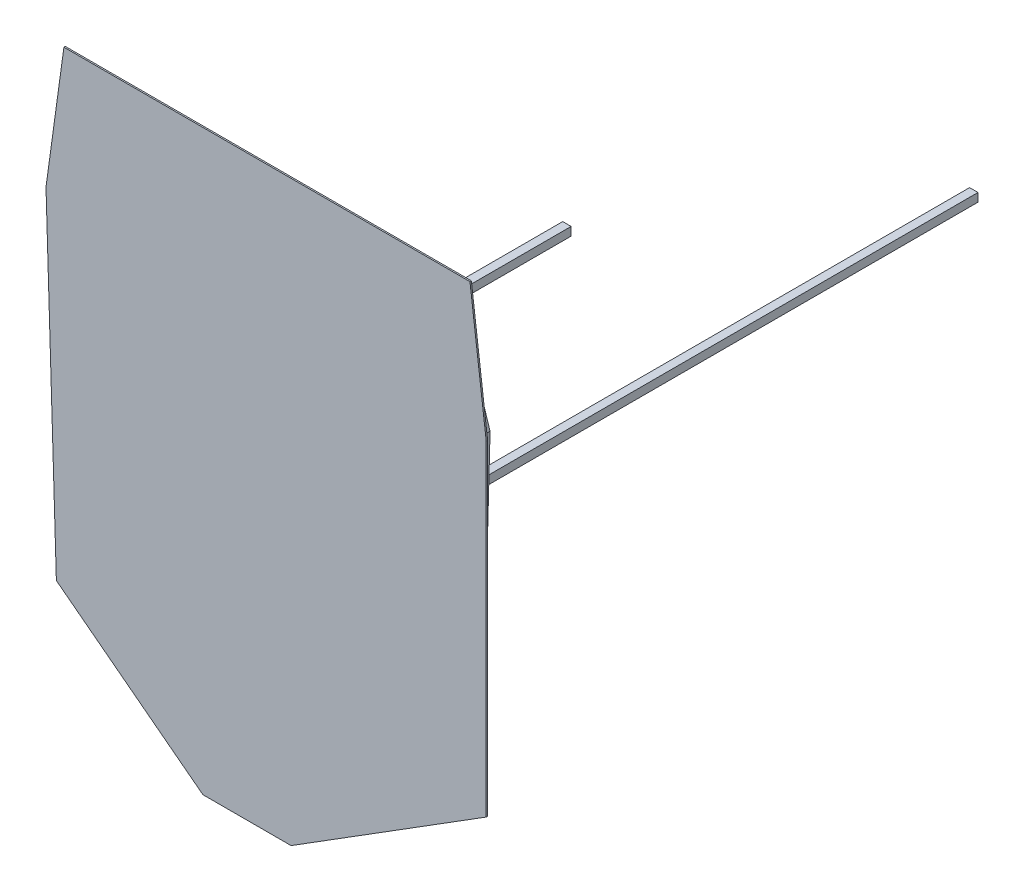
ISO-10303-21;
HEADER;
FILE_DESCRIPTION(('STEP AP214'),'2;1');
FILE_NAME('part.step','',(''),(''),'','','');
FILE_SCHEMA(('AUTOMOTIVE_DESIGN { 1 0 10303 214 1 1 1 1 }'));
ENDSEC;
DATA;
#1=APPLICATION_CONTEXT('core data for automotive mechanical design processes');
#2=APPLICATION_PROTOCOL_DEFINITION('international standard','automotive_design',2000,#1);
#3=PRODUCT_CONTEXT('',#1,'mechanical');
#4=PRODUCT('Part','Part','',(#3));
#5=PRODUCT_RELATED_PRODUCT_CATEGORY('part','',(#4));
#6=PRODUCT_DEFINITION_FORMATION('','',#4);
#7=PRODUCT_DEFINITION_CONTEXT('part definition',#1,'design');
#8=PRODUCT_DEFINITION('design','',#6,#7);
#9=PRODUCT_DEFINITION_SHAPE('','',#8);
#10=(LENGTH_UNIT() NAMED_UNIT(*) SI_UNIT(.MILLI.,.METRE.));
#11=(NAMED_UNIT(*) PLANE_ANGLE_UNIT() SI_UNIT($,.RADIAN.));
#12=(NAMED_UNIT(*) SI_UNIT($,.STERADIAN.) SOLID_ANGLE_UNIT());
#13=UNCERTAINTY_MEASURE_WITH_UNIT(LENGTH_MEASURE(1.E-05),#10,'distance_accuracy_value','');
#14=(GEOMETRIC_REPRESENTATION_CONTEXT(3) GLOBAL_UNCERTAINTY_ASSIGNED_CONTEXT((#13)) GLOBAL_UNIT_ASSIGNED_CONTEXT((#10,
#11,#12)) REPRESENTATION_CONTEXT('',''));
#15=CARTESIAN_POINT('',(0.,0.,0.));
#16=DIRECTION('',(0.,0.,1.));
#17=DIRECTION('',(1.,0.,0.));
#18=AXIS2_PLACEMENT_3D('',#15,#16,#17);
#19=CARTESIAN_POINT('',(0.,0.,0.));
#20=DIRECTION('',(0.,0.,-1.));
#21=DIRECTION('',(-1.,0.,0.));
#22=AXIS2_PLACEMENT_3D('',#19,#20,#21);
#23=PLANE('',#22);
#24=DIRECTION('',(0.0524810845736414,-0.998621918326438,0.));
#25=VECTOR('',#24,1.);
#26=CARTESIAN_POINT('',(-5.37432201257743,-157.093376415422,0.));
#27=LINE('',#26,#25);
#28=CARTESIAN_POINT('',(-17.1380774704205,66.7500166369865,0.));
#29=VERTEX_POINT('',#28);
#30=CARTESIAN_POINT('',(-5.37432201257743,-157.093376415422,0.));
#31=VERTEX_POINT('',#30);
#32=EDGE_CURVE('E281',#29,#31,#27,.T.);
#33=ORIENTED_EDGE('',*,*,#32,.F.);
#34=DIRECTION('',(-0.388851506030991,-0.921300442992095,0.));
#35=VECTOR('',#34,1.);
#36=CARTESIAN_POINT('',(-17.1380774704205,66.7500166369865,0.));
#37=LINE('',#36,#35);
#38=CARTESIAN_POINT('',(11.2463802612385,134.000915956337,0.));
#39=VERTEX_POINT('',#38);
#40=EDGE_CURVE('E303',#39,#29,#37,.T.);
#41=ORIENTED_EDGE('',*,*,#40,.F.);
#42=DIRECTION('',(-1.,0.,0.));
#43=VECTOR('',#42,1.);
#44=CARTESIAN_POINT('',(11.2463802612385,134.000915956337,0.));
#45=LINE('',#44,#43);
#46=CARTESIAN_POINT('',(274.564409594787,134.000915956337,0.));
#47=VERTEX_POINT('',#46);
#48=EDGE_CURVE('E300',#47,#39,#45,.T.);
#49=ORIENTED_EDGE('',*,*,#48,.F.);
#50=DIRECTION('',(-0.305444552392388,0.95220986416536,0.));
#51=VECTOR('',#50,1.);
#52=CARTESIAN_POINT('',(274.564409594787,134.000915956337,0.));
#53=LINE('',#52,#51);
#54=CARTESIAN_POINT('',(292.219085417534,78.96324599172,0.));
#55=VERTEX_POINT('',#54);
#56=EDGE_CURVE('E297',#55,#47,#53,.T.);
#57=ORIENTED_EDGE('',*,*,#56,.F.);
#58=DIRECTION('',(0.0277830020677739,0.999613977891517,0.));
#59=VECTOR('',#58,1.);
#60=CARTESIAN_POINT('',(292.219085417534,78.96324599172,0.));
#61=LINE('',#60,#59);
#62=CARTESIAN_POINT('',(285.658191138842,-157.093376415422,0.));
#63=VERTEX_POINT('',#62);
#64=EDGE_CURVE('E294',#63,#55,#61,.T.);
#65=ORIENTED_EDGE('',*,*,#64,.F.);
#66=DIRECTION('',(0.845314947439892,0.534268321758546,0.));
#67=VECTOR('',#66,1.);
#68=CARTESIAN_POINT('',(285.658191138842,-157.093376415422,0.));
#69=LINE('',#68,#67);
#70=CARTESIAN_POINT('',(157.625700404435,-238.01434458522,0.));
#71=VERTEX_POINT('',#70);
#72=EDGE_CURVE('E291',#71,#63,#69,.T.);
#73=ORIENTED_EDGE('',*,*,#72,.F.);
#74=DIRECTION('',(1.,0.,0.));
#75=VECTOR('',#74,1.);
#76=CARTESIAN_POINT('',(157.625700404435,-238.01434458522,0.));
#77=LINE('',#76,#75);
#78=CARTESIAN_POINT('',(94.9950880538378,-238.01434458522,0.));
#79=VERTEX_POINT('',#78);
#80=EDGE_CURVE('E288',#79,#71,#77,.T.);
#81=ORIENTED_EDGE('',*,*,#80,.F.);
#82=DIRECTION('',(0.778496811313602,-0.627648559923906,0.));
#83=VECTOR('',#82,1.);
#84=CARTESIAN_POINT('',(94.9950880538378,-238.01434458522,0.));
#85=LINE('',#84,#83);
#86=EDGE_CURVE('E284',#31,#79,#85,.T.);
#87=ORIENTED_EDGE('',*,*,#86,.F.);
#88=EDGE_LOOP('',(#33,#41,#49,#57,#65,#73,#81,#87));
#89=FACE_BOUND('',#88,.T.);
#90=DIRECTION('',(-1.,0.,0.));
#91=VECTOR('',#90,1.);
#92=CARTESIAN_POINT('',(0.,-121.721693300611,0.));
#93=LINE('',#92,#91);
#94=CARTESIAN_POINT('',(0.,-121.721693300611,0.));
#95=VERTEX_POINT('',#94);
#96=CARTESIAN_POINT('',(-6.,-121.721693300611,0.));
#97=VERTEX_POINT('',#96);
#98=EDGE_CURVE('E267',#95,#97,#93,.T.);
#99=ORIENTED_EDGE('',*,*,#98,.F.);
#100=DIRECTION('',(0.,-1.,0.));
#101=VECTOR('',#100,1.);
#102=CARTESIAN_POINT('',(0.,-115.721693300611,0.));
#103=LINE('',#102,#101);
#104=CARTESIAN_POINT('',(0.,-115.721693300611,0.));
#105=VERTEX_POINT('',#104);
#106=EDGE_CURVE('E253',#105,#95,#103,.T.);
#107=ORIENTED_EDGE('',*,*,#106,.F.);
#108=DIRECTION('',(1.,0.,0.));
#109=VECTOR('',#108,1.);
#110=CARTESIAN_POINT('',(-6.,-115.721693300611,0.));
#111=LINE('',#110,#109);
#112=CARTESIAN_POINT('',(-6.,-115.721693300611,0.));
#113=VERTEX_POINT('',#112);
#114=EDGE_CURVE('E258',#113,#105,#111,.T.);
#115=ORIENTED_EDGE('',*,*,#114,.F.);
#116=DIRECTION('',(0.,1.,0.));
#117=VECTOR('',#116,1.);
#118=CARTESIAN_POINT('',(-6.,-121.721693300611,0.));
#119=LINE('',#118,#117);
#120=EDGE_CURVE('E269',#97,#113,#119,.T.);
#121=ORIENTED_EDGE('',*,*,#120,.F.);
#122=EDGE_LOOP('',(#99,#107,#115,#121));
#123=FACE_BOUND('',#122,.T.);
#124=DIRECTION('',(1.,0.,0.));
#125=VECTOR('',#124,1.);
#126=CARTESIAN_POINT('',(284.,50.2389394642747,0.));
#127=LINE('',#126,#125);
#128=CARTESIAN_POINT('',(284.,50.2389394642747,0.));
#129=VERTEX_POINT('',#128);
#130=CARTESIAN_POINT('',(290.,50.2389394642747,0.));
#131=VERTEX_POINT('',#130);
#132=EDGE_CURVE('E224',#129,#131,#127,.T.);
#133=ORIENTED_EDGE('',*,*,#132,.F.);
#134=DIRECTION('',(0.,1.,0.));
#135=VECTOR('',#134,1.);
#136=CARTESIAN_POINT('',(284.,44.2389394642747,0.));
#137=LINE('',#136,#135);
#138=CARTESIAN_POINT('',(284.,44.2389394642747,0.));
#139=VERTEX_POINT('',#138);
#140=EDGE_CURVE('E221',#139,#129,#137,.T.);
#141=ORIENTED_EDGE('',*,*,#140,.F.);
#142=DIRECTION('',(-1.,0.,0.));
#143=VECTOR('',#142,1.);
#144=CARTESIAN_POINT('',(284.,44.2389394642747,0.));
#145=LINE('',#144,#143);
#146=CARTESIAN_POINT('',(290.,44.2389394642747,0.));
#147=VERTEX_POINT('',#146);
#148=EDGE_CURVE('E234',#147,#139,#145,.T.);
#149=ORIENTED_EDGE('',*,*,#148,.F.);
#150=DIRECTION('',(0.,-1.,0.));
#151=VECTOR('',#150,1.);
#152=CARTESIAN_POINT('',(290.,44.2389394642747,0.));
#153=LINE('',#152,#151);
#154=EDGE_CURVE('E242',#131,#147,#153,.T.);
#155=ORIENTED_EDGE('',*,*,#154,.F.);
#156=EDGE_LOOP('',(#133,#141,#149,#155));
#157=FACE_BOUND('',#156,.T.);
#158=ADVANCED_FACE('F33',(#89,#123,#157),#23,.T.);
#159=CARTESIAN_POINT('',(-5.37432201257743,-157.093376415422,0.));
#160=DIRECTION('',(-0.998621918326438,-0.0524810845736414,0.));
#161=DIRECTION('',(0.0524810845736414,-0.998621918326438,0.));
#162=AXIS2_PLACEMENT_3D('',#159,#160,#161);
#163=PLANE('',#162);
#164=DIRECTION('',(0.0524810845736414,-0.998621918326438,0.));
#165=VECTOR('',#164,1.);
#166=CARTESIAN_POINT('',(-5.37432201257743,-157.093376415422,5.));
#167=LINE('',#166,#165);
#168=CARTESIAN_POINT('',(-17.1380774704205,66.7500166369865,5.));
#169=VERTEX_POINT('',#168);
#170=CARTESIAN_POINT('',(-5.37432201257743,-157.093376415422,5.));
#171=VERTEX_POINT('',#170);
#172=EDGE_CURVE('E280',#169,#171,#167,.T.);
#173=ORIENTED_EDGE('',*,*,#172,.F.);
#174=DIRECTION('',(0.,0.,1.));
#175=VECTOR('',#174,1.);
#176=CARTESIAN_POINT('',(-17.1380774704205,66.7500166369865,0.));
#177=LINE('',#176,#175);
#178=EDGE_CURVE('E11',#29,#169,#177,.T.);
#179=ORIENTED_EDGE('',*,*,#178,.F.);
#180=ORIENTED_EDGE('',*,*,#32,.T.);
#181=DIRECTION('',(0.,0.,1.));
#182=VECTOR('',#181,1.);
#183=CARTESIAN_POINT('',(-5.37432201257743,-157.093376415422,0.));
#184=LINE('',#183,#182);
#185=EDGE_CURVE('E36',#31,#171,#184,.T.);
#186=ORIENTED_EDGE('',*,*,#185,.T.);
#187=EDGE_LOOP('',(#173,#179,#180,#186));
#188=FACE_BOUND('',#187,.T.);
#189=ADVANCED_FACE('F342',(#188),#163,.T.);
#190=CARTESIAN_POINT('',(-17.1380774704205,66.7500166369865,0.));
#191=DIRECTION('',(-0.921300442992095,0.388851506030991,0.));
#192=DIRECTION('',(-0.388851506030991,-0.921300442992095,0.));
#193=AXIS2_PLACEMENT_3D('',#190,#191,#192);
#194=PLANE('',#193);
#195=DIRECTION('',(-0.388851506030991,-0.921300442992095,0.));
#196=VECTOR('',#195,1.);
#197=CARTESIAN_POINT('',(-17.1380774704205,66.7500166369865,5.));
#198=LINE('',#197,#196);
#199=CARTESIAN_POINT('',(11.2463802612385,134.000915956337,5.));
#200=VERTEX_POINT('',#199);
#201=EDGE_CURVE('E285',#200,#169,#198,.T.);
#202=ORIENTED_EDGE('',*,*,#201,.F.);
#203=DIRECTION('',(0.,0.,1.));
#204=VECTOR('',#203,1.);
#205=CARTESIAN_POINT('',(11.2463802612385,134.000915956337,0.));
#206=LINE('',#205,#204);
#207=EDGE_CURVE('E41',#39,#200,#206,.T.);
#208=ORIENTED_EDGE('',*,*,#207,.F.);
#209=ORIENTED_EDGE('',*,*,#40,.T.);
#210=ORIENTED_EDGE('',*,*,#178,.T.);
#211=EDGE_LOOP('',(#202,#208,#209,#210));
#212=FACE_BOUND('',#211,.T.);
#213=ADVANCED_FACE('F352',(#212),#194,.T.);
#214=CARTESIAN_POINT('',(11.2463802612385,134.000915956337,0.));
#215=DIRECTION('',(0.,1.,0.));
#216=DIRECTION('',(0.,0.,1.));
#217=AXIS2_PLACEMENT_3D('',#214,#215,#216);
#218=PLANE('',#217);
#219=DIRECTION('',(-1.,0.,0.));
#220=VECTOR('',#219,1.);
#221=CARTESIAN_POINT('',(11.2463802612385,134.000915956337,5.));
#222=LINE('',#221,#220);
#223=CARTESIAN_POINT('',(274.564409594787,134.000915956337,5.));
#224=VERTEX_POINT('',#223);
#225=EDGE_CURVE('E323',#224,#200,#222,.T.);
#226=ORIENTED_EDGE('',*,*,#225,.F.);
#227=DIRECTION('',(0.,0.,1.));
#228=VECTOR('',#227,1.);
#229=CARTESIAN_POINT('',(274.564409594787,134.000915956337,0.));
#230=LINE('',#229,#228);
#231=EDGE_CURVE('E329',#47,#224,#230,.T.);
#232=ORIENTED_EDGE('',*,*,#231,.F.);
#233=ORIENTED_EDGE('',*,*,#48,.T.);
#234=ORIENTED_EDGE('',*,*,#207,.T.);
#235=EDGE_LOOP('',(#226,#232,#233,#234));
#236=FACE_BOUND('',#235,.T.);
#237=ADVANCED_FACE('F373',(#236),#218,.T.);
#238=CARTESIAN_POINT('',(274.564409594787,134.000915956337,0.));
#239=DIRECTION('',(0.95220986416536,0.305444552392388,0.));
#240=DIRECTION('',(-0.305444552392388,0.95220986416536,0.));
#241=AXIS2_PLACEMENT_3D('',#238,#239,#240);
#242=PLANE('',#241);
#243=DIRECTION('',(-0.305444552392388,0.95220986416536,0.));
#244=VECTOR('',#243,1.);
#245=CARTESIAN_POINT('',(274.564409594787,134.000915956337,5.));
#246=LINE('',#245,#244);
#247=CARTESIAN_POINT('',(292.219085417534,78.96324599172,5.));
#248=VERTEX_POINT('',#247);
#249=EDGE_CURVE('E320',#248,#224,#246,.T.);
#250=ORIENTED_EDGE('',*,*,#249,.F.);
#251=DIRECTION('',(0.,0.,1.));
#252=VECTOR('',#251,1.);
#253=CARTESIAN_POINT('',(292.219085417534,78.96324599172,0.));
#254=LINE('',#253,#252);
#255=EDGE_CURVE('E331',#55,#248,#254,.T.);
#256=ORIENTED_EDGE('',*,*,#255,.F.);
#257=ORIENTED_EDGE('',*,*,#56,.T.);
#258=ORIENTED_EDGE('',*,*,#231,.T.);
#259=EDGE_LOOP('',(#250,#256,#257,#258));
#260=FACE_BOUND('',#259,.T.);
#261=ADVANCED_FACE('F371',(#260),#242,.T.);
#262=CARTESIAN_POINT('',(292.219085417534,78.96324599172,0.));
#263=DIRECTION('',(0.999613977891517,-0.0277830020677739,0.));
#264=DIRECTION('',(0.0277830020677739,0.999613977891517,0.));
#265=AXIS2_PLACEMENT_3D('',#262,#263,#264);
#266=PLANE('',#265);
#267=DIRECTION('',(0.0277830020677739,0.999613977891517,0.));
#268=VECTOR('',#267,1.);
#269=CARTESIAN_POINT('',(292.219085417534,78.96324599172,5.));
#270=LINE('',#269,#268);
#271=CARTESIAN_POINT('',(285.658191138842,-157.093376415422,5.));
#272=VERTEX_POINT('',#271);
#273=EDGE_CURVE('E317',#272,#248,#270,.T.);
#274=ORIENTED_EDGE('',*,*,#273,.F.);
#275=DIRECTION('',(0.,0.,1.));
#276=VECTOR('',#275,1.);
#277=CARTESIAN_POINT('',(285.658191138842,-157.093376415422,0.));
#278=LINE('',#277,#276);
#279=EDGE_CURVE('E333',#63,#272,#278,.T.);
#280=ORIENTED_EDGE('',*,*,#279,.F.);
#281=ORIENTED_EDGE('',*,*,#64,.T.);
#282=ORIENTED_EDGE('',*,*,#255,.T.);
#283=EDGE_LOOP('',(#274,#280,#281,#282));
#284=FACE_BOUND('',#283,.T.);
#285=ADVANCED_FACE('F367',(#284),#266,.T.);
#286=CARTESIAN_POINT('',(285.658191138842,-157.093376415422,0.));
#287=DIRECTION('',(0.534268321758546,-0.845314947439892,0.));
#288=DIRECTION('',(0.845314947439892,0.534268321758546,0.));
#289=AXIS2_PLACEMENT_3D('',#286,#287,#288);
#290=PLANE('',#289);
#291=DIRECTION('',(0.845314947439892,0.534268321758546,0.));
#292=VECTOR('',#291,1.);
#293=CARTESIAN_POINT('',(285.658191138842,-157.093376415422,5.));
#294=LINE('',#293,#292);
#295=CARTESIAN_POINT('',(157.625700404435,-238.01434458522,5.));
#296=VERTEX_POINT('',#295);
#297=EDGE_CURVE('E314',#296,#272,#294,.T.);
#298=ORIENTED_EDGE('',*,*,#297,.F.);
#299=DIRECTION('',(0.,0.,1.));
#300=VECTOR('',#299,1.);
#301=CARTESIAN_POINT('',(157.625700404435,-238.01434458522,0.));
#302=LINE('',#301,#300);
#303=EDGE_CURVE('E335',#71,#296,#302,.T.);
#304=ORIENTED_EDGE('',*,*,#303,.F.);
#305=ORIENTED_EDGE('',*,*,#72,.T.);
#306=ORIENTED_EDGE('',*,*,#279,.T.);
#307=EDGE_LOOP('',(#298,#304,#305,#306));
#308=FACE_BOUND('',#307,.T.);
#309=ADVANCED_FACE('F365',(#308),#290,.T.);
#310=CARTESIAN_POINT('',(157.625700404435,-238.01434458522,0.));
#311=DIRECTION('',(0.,-1.,0.));
#312=DIRECTION('',(0.,0.,-1.));
#313=AXIS2_PLACEMENT_3D('',#310,#311,#312);
#314=PLANE('',#313);
#315=DIRECTION('',(1.,0.,0.));
#316=VECTOR('',#315,1.);
#317=CARTESIAN_POINT('',(157.625700404435,-238.01434458522,5.));
#318=LINE('',#317,#316);
#319=CARTESIAN_POINT('',(94.9950880538378,-238.01434458522,5.));
#320=VERTEX_POINT('',#319);
#321=EDGE_CURVE('E311',#320,#296,#318,.T.);
#322=ORIENTED_EDGE('',*,*,#321,.F.);
#323=DIRECTION('',(0.,0.,1.));
#324=VECTOR('',#323,1.);
#325=CARTESIAN_POINT('',(94.9950880538378,-238.01434458522,0.));
#326=LINE('',#325,#324);
#327=EDGE_CURVE('E336',#79,#320,#326,.T.);
#328=ORIENTED_EDGE('',*,*,#327,.F.);
#329=ORIENTED_EDGE('',*,*,#80,.T.);
#330=ORIENTED_EDGE('',*,*,#303,.T.);
#331=EDGE_LOOP('',(#322,#328,#329,#330));
#332=FACE_BOUND('',#331,.T.);
#333=ADVANCED_FACE('F361',(#332),#314,.T.);
#334=CARTESIAN_POINT('',(94.9950880538378,-238.01434458522,0.));
#335=DIRECTION('',(-0.627648559923906,-0.778496811313602,0.));
#336=DIRECTION('',(0.778496811313602,-0.627648559923906,0.));
#337=AXIS2_PLACEMENT_3D('',#334,#335,#336);
#338=PLANE('',#337);
#339=DIRECTION('',(0.778496811313602,-0.627648559923906,0.));
#340=VECTOR('',#339,1.);
#341=CARTESIAN_POINT('',(94.9950880538378,-238.01434458522,5.));
#342=LINE('',#341,#340);
#343=EDGE_CURVE('E308',#171,#320,#342,.T.);
#344=ORIENTED_EDGE('',*,*,#343,.F.);
#345=ORIENTED_EDGE('',*,*,#185,.F.);
#346=ORIENTED_EDGE('',*,*,#86,.T.);
#347=ORIENTED_EDGE('',*,*,#327,.T.);
#348=EDGE_LOOP('',(#344,#345,#346,#347));
#349=FACE_BOUND('',#348,.T.);
#350=ADVANCED_FACE('F345',(#349),#338,.T.);
#351=CARTESIAN_POINT('',(0.,-115.721693300611,-350.));
#352=DIRECTION('',(-1.,0.,0.));
#353=DIRECTION('',(0.,0.,1.));
#354=AXIS2_PLACEMENT_3D('',#351,#352,#353);
#355=PLANE('',#354);
#356=ORIENTED_EDGE('',*,*,#106,.T.);
#357=DIRECTION('',(0.,0.,1.));
#358=VECTOR('',#357,1.);
#359=CARTESIAN_POINT('',(0.,-121.721693300611,-350.));
#360=LINE('',#359,#358);
#361=CARTESIAN_POINT('',(0.,-121.721693300611,-350.));
#362=VERTEX_POINT('',#361);
#363=EDGE_CURVE('E278',#362,#95,#360,.T.);
#364=ORIENTED_EDGE('',*,*,#363,.F.);
#365=DIRECTION('',(0.,-1.,0.));
#366=VECTOR('',#365,1.);
#367=CARTESIAN_POINT('',(0.,-115.721693300611,-350.));
#368=LINE('',#367,#366);
#369=CARTESIAN_POINT('',(0.,-115.721693300611,-350.));
#370=VERTEX_POINT('',#369);
#371=EDGE_CURVE('E254',#370,#362,#368,.T.);
#372=ORIENTED_EDGE('',*,*,#371,.F.);
#373=DIRECTION('',(0.,0.,1.));
#374=VECTOR('',#373,1.);
#375=CARTESIAN_POINT('',(0.,-115.721693300611,-350.));
#376=LINE('',#375,#374);
#377=EDGE_CURVE('E264',#370,#105,#376,.T.);
#378=ORIENTED_EDGE('',*,*,#377,.T.);
#379=EDGE_LOOP('',(#356,#364,#372,#378));
#380=FACE_BOUND('',#379,.T.);
#381=ADVANCED_FACE('F391',(#380),#355,.F.);
#382=CARTESIAN_POINT('',(0.,-121.721693300611,-350.));
#383=DIRECTION('',(0.,1.,0.));
#384=DIRECTION('',(0.,0.,1.));
#385=AXIS2_PLACEMENT_3D('',#382,#383,#384);
#386=PLANE('',#385);
#387=ORIENTED_EDGE('',*,*,#98,.T.);
#388=DIRECTION('',(0.,0.,1.));
#389=VECTOR('',#388,1.);
#390=CARTESIAN_POINT('',(-6.,-121.721693300611,-350.));
#391=LINE('',#390,#389);
#392=CARTESIAN_POINT('',(-6.,-121.721693300611,-350.));
#393=VERTEX_POINT('',#392);
#394=EDGE_CURVE('E275',#393,#97,#391,.T.);
#395=ORIENTED_EDGE('',*,*,#394,.F.);
#396=DIRECTION('',(-1.,0.,0.));
#397=VECTOR('',#396,1.);
#398=CARTESIAN_POINT('',(0.,-121.721693300611,-350.));
#399=LINE('',#398,#397);
#400=EDGE_CURVE('E257',#362,#393,#399,.T.);
#401=ORIENTED_EDGE('',*,*,#400,.F.);
#402=ORIENTED_EDGE('',*,*,#363,.T.);
#403=EDGE_LOOP('',(#387,#395,#401,#402));
#404=FACE_BOUND('',#403,.T.);
#405=ADVANCED_FACE('F420',(#404),#386,.F.);
#406=CARTESIAN_POINT('',(-6.,-121.721693300611,-350.));
#407=DIRECTION('',(1.,0.,0.));
#408=DIRECTION('',(0.,0.,-1.));
#409=AXIS2_PLACEMENT_3D('',#406,#407,#408);
#410=PLANE('',#409);
#411=ORIENTED_EDGE('',*,*,#120,.T.);
#412=DIRECTION('',(0.,0.,1.));
#413=VECTOR('',#412,1.);
#414=CARTESIAN_POINT('',(-6.,-115.721693300611,-350.));
#415=LINE('',#414,#413);
#416=CARTESIAN_POINT('',(-6.,-115.721693300611,-350.));
#417=VERTEX_POINT('',#416);
#418=EDGE_CURVE('E57',#417,#113,#415,.T.);
#419=ORIENTED_EDGE('',*,*,#418,.F.);
#420=DIRECTION('',(0.,1.,0.));
#421=VECTOR('',#420,1.);
#422=CARTESIAN_POINT('',(-6.,-121.721693300611,-350.));
#423=LINE('',#422,#421);
#424=EDGE_CURVE('E260',#393,#417,#423,.T.);
#425=ORIENTED_EDGE('',*,*,#424,.F.);
#426=ORIENTED_EDGE('',*,*,#394,.T.);
#427=EDGE_LOOP('',(#411,#419,#425,#426));
#428=FACE_BOUND('',#427,.T.);
#429=ADVANCED_FACE('F428',(#428),#410,.F.);
#430=CARTESIAN_POINT('',(-6.,-115.721693300611,-350.));
#431=DIRECTION('',(0.,-1.,0.));
#432=DIRECTION('',(0.,0.,-1.));
#433=AXIS2_PLACEMENT_3D('',#430,#431,#432);
#434=PLANE('',#433);
#435=ORIENTED_EDGE('',*,*,#114,.T.);
#436=ORIENTED_EDGE('',*,*,#377,.F.);
#437=DIRECTION('',(1.,0.,0.));
#438=VECTOR('',#437,1.);
#439=CARTESIAN_POINT('',(-6.,-115.721693300611,-350.));
#440=LINE('',#439,#438);
#441=EDGE_CURVE('E262',#417,#370,#440,.T.);
#442=ORIENTED_EDGE('',*,*,#441,.F.);
#443=ORIENTED_EDGE('',*,*,#418,.T.);
#444=EDGE_LOOP('',(#435,#436,#442,#443));
#445=FACE_BOUND('',#444,.T.);
#446=ADVANCED_FACE('F436',(#445),#434,.F.);
#447=CARTESIAN_POINT('',(0.,0.,-350.));
#448=DIRECTION('',(0.,0.,-1.));
#449=DIRECTION('',(-1.,0.,0.));
#450=AXIS2_PLACEMENT_3D('',#447,#448,#449);
#451=PLANE('',#450);
#452=ORIENTED_EDGE('',*,*,#371,.T.);
#453=ORIENTED_EDGE('',*,*,#400,.T.);
#454=ORIENTED_EDGE('',*,*,#424,.T.);
#455=ORIENTED_EDGE('',*,*,#441,.T.);
#456=EDGE_LOOP('',(#452,#453,#454,#455));
#457=FACE_BOUND('',#456,.T.);
#458=ADVANCED_FACE('F444',(#457),#451,.T.);
#459=CARTESIAN_POINT('',(284.,44.2389394642747,-350.));
#460=DIRECTION('',(1.,0.,0.));
#461=DIRECTION('',(0.,0.,-1.));
#462=AXIS2_PLACEMENT_3D('',#459,#460,#461);
#463=PLANE('',#462);
#464=ORIENTED_EDGE('',*,*,#140,.T.);
#465=DIRECTION('',(0.,0.,1.));
#466=VECTOR('',#465,1.);
#467=CARTESIAN_POINT('',(284.,50.2389394642747,-350.));
#468=LINE('',#467,#466);
#469=CARTESIAN_POINT('',(284.,50.2389394642747,-350.));
#470=VERTEX_POINT('',#469);
#471=EDGE_CURVE('E251',#470,#129,#468,.T.);
#472=ORIENTED_EDGE('',*,*,#471,.F.);
#473=DIRECTION('',(0.,1.,0.));
#474=VECTOR('',#473,1.);
#475=CARTESIAN_POINT('',(284.,44.2389394642747,-350.));
#476=LINE('',#475,#474);
#477=CARTESIAN_POINT('',(284.,44.2389394642747,-350.));
#478=VERTEX_POINT('',#477);
#479=EDGE_CURVE('E230',#478,#470,#476,.T.);
#480=ORIENTED_EDGE('',*,*,#479,.F.);
#481=DIRECTION('',(0.,0.,1.));
#482=VECTOR('',#481,1.);
#483=CARTESIAN_POINT('',(284.,44.2389394642747,-350.));
#484=LINE('',#483,#482);
#485=EDGE_CURVE('E239',#478,#139,#484,.T.);
#486=ORIENTED_EDGE('',*,*,#485,.T.);
#487=EDGE_LOOP('',(#464,#472,#480,#486));
#488=FACE_BOUND('',#487,.T.);
#489=ADVANCED_FACE('F451',(#488),#463,.F.);
#490=CARTESIAN_POINT('',(284.,50.2389394642747,-350.));
#491=DIRECTION('',(0.,-1.,0.));
#492=DIRECTION('',(0.,0.,-1.));
#493=AXIS2_PLACEMENT_3D('',#490,#491,#492);
#494=PLANE('',#493);
#495=ORIENTED_EDGE('',*,*,#132,.T.);
#496=DIRECTION('',(0.,0.,1.));
#497=VECTOR('',#496,1.);
#498=CARTESIAN_POINT('',(290.,50.2389394642747,-350.));
#499=LINE('',#498,#497);
#500=CARTESIAN_POINT('',(290.,50.2389394642747,-350.));
#501=VERTEX_POINT('',#500);
#502=EDGE_CURVE('E248',#501,#131,#499,.T.);
#503=ORIENTED_EDGE('',*,*,#502,.F.);
#504=DIRECTION('',(1.,0.,0.));
#505=VECTOR('',#504,1.);
#506=CARTESIAN_POINT('',(284.,50.2389394642747,-350.));
#507=LINE('',#506,#505);
#508=EDGE_CURVE('E233',#470,#501,#507,.T.);
#509=ORIENTED_EDGE('',*,*,#508,.F.);
#510=ORIENTED_EDGE('',*,*,#471,.T.);
#511=EDGE_LOOP('',(#495,#503,#509,#510));
#512=FACE_BOUND('',#511,.T.);
#513=ADVANCED_FACE('F459',(#512),#494,.F.);
#514=CARTESIAN_POINT('',(290.,44.2389394642747,-350.));
#515=DIRECTION('',(-1.,0.,0.));
#516=DIRECTION('',(0.,0.,1.));
#517=AXIS2_PLACEMENT_3D('',#514,#515,#516);
#518=PLANE('',#517);
#519=ORIENTED_EDGE('',*,*,#154,.T.);
#520=DIRECTION('',(0.,0.,1.));
#521=VECTOR('',#520,1.);
#522=CARTESIAN_POINT('',(290.,44.2389394642747,-350.));
#523=LINE('',#522,#521);
#524=CARTESIAN_POINT('',(290.,44.2389394642747,-350.));
#525=VERTEX_POINT('',#524);
#526=EDGE_CURVE('E49',#525,#147,#523,.T.);
#527=ORIENTED_EDGE('',*,*,#526,.F.);
#528=DIRECTION('',(0.,-1.,0.));
#529=VECTOR('',#528,1.);
#530=CARTESIAN_POINT('',(290.,44.2389394642747,-350.));
#531=LINE('',#530,#529);
#532=EDGE_CURVE('E236',#501,#525,#531,.T.);
#533=ORIENTED_EDGE('',*,*,#532,.F.);
#534=ORIENTED_EDGE('',*,*,#502,.T.);
#535=EDGE_LOOP('',(#519,#527,#533,#534));
#536=FACE_BOUND('',#535,.T.);
#537=ADVANCED_FACE('F467',(#536),#518,.F.);
#538=CARTESIAN_POINT('',(284.,44.2389394642747,-350.));
#539=DIRECTION('',(0.,1.,0.));
#540=DIRECTION('',(0.,0.,1.));
#541=AXIS2_PLACEMENT_3D('',#538,#539,#540);
#542=PLANE('',#541);
#543=ORIENTED_EDGE('',*,*,#148,.T.);
#544=ORIENTED_EDGE('',*,*,#485,.F.);
#545=DIRECTION('',(-1.,0.,0.));
#546=VECTOR('',#545,1.);
#547=CARTESIAN_POINT('',(284.,44.2389394642747,-350.));
#548=LINE('',#547,#546);
#549=EDGE_CURVE('E238',#525,#478,#548,.T.);
#550=ORIENTED_EDGE('',*,*,#549,.F.);
#551=ORIENTED_EDGE('',*,*,#526,.T.);
#552=EDGE_LOOP('',(#543,#544,#550,#551));
#553=FACE_BOUND('',#552,.T.);
#554=ADVANCED_FACE('F475',(#553),#542,.F.);
#555=CARTESIAN_POINT('',(0.,0.,-350.));
#556=DIRECTION('',(0.,0.,-1.));
#557=DIRECTION('',(-1.,0.,0.));
#558=AXIS2_PLACEMENT_3D('',#555,#556,#557);
#559=PLANE('',#558);
#560=ORIENTED_EDGE('',*,*,#479,.T.);
#561=ORIENTED_EDGE('',*,*,#508,.T.);
#562=ORIENTED_EDGE('',*,*,#532,.T.);
#563=ORIENTED_EDGE('',*,*,#549,.T.);
#564=EDGE_LOOP('',(#560,#561,#562,#563));
#565=FACE_BOUND('',#564,.T.);
#566=ADVANCED_FACE('F483',(#565),#559,.T.);
#567=CARTESIAN_POINT('',(-18.3000871357051,77.4203672634927,6.));
#568=DIRECTION('',(0.990654605441083,-0.136394474662178,0.));
#569=DIRECTION('',(0.136394474662178,0.990654605441083,0.));
#570=AXIS2_PLACEMENT_3D('',#567,#568,#569);
#571=PLANE('',#570);
#572=DIRECTION('',(-0.136394474662178,-0.990654605441083,0.));
#573=VECTOR('',#572,1.);
#574=CARTESIAN_POINT('',(-18.3000871357051,77.4203672634927,5.));
#575=LINE('',#574,#573);
#576=CARTESIAN_POINT('',(-5.53385871640621,170.143499993137,5.));
#577=VERTEX_POINT('',#576);
#578=CARTESIAN_POINT('',(-18.3000871357051,77.4203672634927,5.));
#579=VERTEX_POINT('',#578);
#580=EDGE_CURVE('E220',#577,#579,#575,.T.);
#581=ORIENTED_EDGE('',*,*,#580,.T.);
#582=DIRECTION('',(0.,0.,-1.));
#583=VECTOR('',#582,1.);
#584=CARTESIAN_POINT('',(-18.3000871357051,77.4203672634927,6.));
#585=LINE('',#584,#583);
#586=CARTESIAN_POINT('',(-18.3000871357051,77.4203672634927,6.));
#587=VERTEX_POINT('',#586);
#588=EDGE_CURVE('E200',#587,#579,#585,.T.);
#589=ORIENTED_EDGE('',*,*,#588,.F.);
#590=DIRECTION('',(-0.136394474662178,-0.990654605441083,0.));
#591=VECTOR('',#590,1.);
#592=CARTESIAN_POINT('',(-18.3000871357051,77.4203672634927,6.));
#593=LINE('',#592,#591);
#594=CARTESIAN_POINT('',(-5.53385871640621,170.143499993137,6.));
#595=VERTEX_POINT('',#594);
#596=EDGE_CURVE('E207',#595,#587,#593,.T.);
#597=ORIENTED_EDGE('',*,*,#596,.F.);
#598=DIRECTION('',(0.,0.,-1.));
#599=VECTOR('',#598,1.);
#600=CARTESIAN_POINT('',(-5.53385871640621,170.143499993137,6.));
#601=LINE('',#600,#599);
#602=EDGE_CURVE('E639',#595,#577,#601,.T.);
#603=ORIENTED_EDGE('',*,*,#602,.T.);
#604=EDGE_LOOP('',(#581,#589,#597,#603));
#605=FACE_BOUND('',#604,.T.);
#606=ADVANCED_FACE('F218',(#605),#571,.F.);
#607=CARTESIAN_POINT('',(-10.9091127876899,-161.778438908634,6.));
#608=DIRECTION('',(0.999522971270315,0.0308841367527345,0.));
#609=DIRECTION('',(-0.0308841367527345,0.999522971270315,0.));
#610=AXIS2_PLACEMENT_3D('',#607,#608,#609);
#611=PLANE('',#610);
#612=DIRECTION('',(0.0308841367527345,-0.999522971270315,0.));
#613=VECTOR('',#612,1.);
#614=CARTESIAN_POINT('',(-10.9091127876899,-161.778438908634,5.));
#615=LINE('',#614,#613);
#616=CARTESIAN_POINT('',(-10.9091127876899,-161.778438908634,5.));
#617=VERTEX_POINT('',#616);
#618=EDGE_CURVE('E647',#579,#617,#615,.T.);
#619=ORIENTED_EDGE('',*,*,#618,.T.);
#620=DIRECTION('',(0.,0.,-1.));
#621=VECTOR('',#620,1.);
#622=CARTESIAN_POINT('',(-10.9091127876899,-161.778438908634,6.));
#623=LINE('',#622,#621);
#624=CARTESIAN_POINT('',(-10.9091127876899,-161.778438908634,6.));
#625=VERTEX_POINT('',#624);
#626=EDGE_CURVE('E203',#625,#617,#623,.T.);
#627=ORIENTED_EDGE('',*,*,#626,.F.);
#628=DIRECTION('',(0.0308841367527345,-0.999522971270315,0.));
#629=VECTOR('',#628,1.);
#630=CARTESIAN_POINT('',(-10.9091127876899,-161.778438908634,6.));
#631=LINE('',#630,#629);
#632=EDGE_CURVE('E196',#587,#625,#631,.T.);
#633=ORIENTED_EDGE('',*,*,#632,.F.);
#634=ORIENTED_EDGE('',*,*,#588,.T.);
#635=EDGE_LOOP('',(#619,#627,#633,#634));
#636=FACE_BOUND('',#635,.T.);
#637=ADVANCED_FACE('F198',(#636),#611,.F.);
#638=CARTESIAN_POINT('',(93.5299444968026,-241.73534321898,6.));
#639=DIRECTION('',(0.607890137016932,0.794021146643801,0.));
#640=DIRECTION('',(-0.794021146643801,0.607890137016932,0.));
#641=AXIS2_PLACEMENT_3D('',#638,#639,#640);
#642=PLANE('',#641);
#643=DIRECTION('',(0.794021146643801,-0.607890137016932,0.));
#644=VECTOR('',#643,1.);
#645=CARTESIAN_POINT('',(93.5299444968026,-241.73534321898,5.));
#646=LINE('',#645,#644);
#647=CARTESIAN_POINT('',(93.5299444968026,-241.73534321898,5.));
#648=VERTEX_POINT('',#647);
#649=EDGE_CURVE('E649',#617,#648,#646,.T.);
#650=ORIENTED_EDGE('',*,*,#649,.T.);
#651=DIRECTION('',(0.,0.,-1.));
#652=VECTOR('',#651,1.);
#653=CARTESIAN_POINT('',(93.5299444968026,-241.73534321898,6.));
#654=LINE('',#653,#652);
#655=CARTESIAN_POINT('',(93.5299444968026,-241.73534321898,6.));
#656=VERTEX_POINT('',#655);
#657=EDGE_CURVE('E226',#656,#648,#654,.T.);
#658=ORIENTED_EDGE('',*,*,#657,.F.);
#659=DIRECTION('',(0.794021146643801,-0.607890137016932,0.));
#660=VECTOR('',#659,1.);
#661=CARTESIAN_POINT('',(93.5299444968026,-241.73534321898,6.));
#662=LINE('',#661,#660);
#663=EDGE_CURVE('E206',#625,#656,#662,.T.);
#664=ORIENTED_EDGE('',*,*,#663,.F.);
#665=ORIENTED_EDGE('',*,*,#626,.T.);
#666=EDGE_LOOP('',(#650,#658,#664,#665));
#667=FACE_BOUND('',#666,.T.);
#668=ADVANCED_FACE('F502',(#667),#642,.F.);
#669=CARTESIAN_POINT('',(156.395670181017,-241.73534321898,6.));
#670=DIRECTION('',(0.,1.,0.));
#671=DIRECTION('',(0.,0.,1.));
#672=AXIS2_PLACEMENT_3D('',#669,#670,#671);
#673=PLANE('',#672);
#674=DIRECTION('',(1.,0.,0.));
#675=VECTOR('',#674,1.);
#676=CARTESIAN_POINT('',(156.395670181017,-241.73534321898,5.));
#677=LINE('',#676,#675);
#678=CARTESIAN_POINT('',(156.395670181017,-241.73534321898,5.));
#679=VERTEX_POINT('',#678);
#680=EDGE_CURVE('E655',#648,#679,#677,.T.);
#681=ORIENTED_EDGE('',*,*,#680,.T.);
#682=DIRECTION('',(0.,0.,-1.));
#683=VECTOR('',#682,1.);
#684=CARTESIAN_POINT('',(156.395670181017,-241.73534321898,6.));
#685=LINE('',#684,#683);
#686=CARTESIAN_POINT('',(156.395670181017,-241.73534321898,6.));
#687=VERTEX_POINT('',#686);
#688=EDGE_CURVE('E669',#687,#679,#685,.T.);
#689=ORIENTED_EDGE('',*,*,#688,.F.);
#690=DIRECTION('',(1.,0.,0.));
#691=VECTOR('',#690,1.);
#692=CARTESIAN_POINT('',(156.395670181017,-241.73534321898,6.));
#693=LINE('',#692,#691);
#694=EDGE_CURVE('E676',#656,#687,#693,.T.);
#695=ORIENTED_EDGE('',*,*,#694,.F.);
#696=ORIENTED_EDGE('',*,*,#657,.T.);
#697=EDGE_LOOP('',(#681,#689,#695,#696));
#698=FACE_BOUND('',#697,.T.);
#699=ADVANCED_FACE('F509',(#698),#673,.F.);
#700=CARTESIAN_POINT('',(295.480369275483,-154.566750540689,6.));
#701=DIRECTION('',(-0.531052829619194,0.847338711586723,0.));
#702=DIRECTION('',(-0.847338711586723,-0.531052829619194,0.));
#703=AXIS2_PLACEMENT_3D('',#700,#701,#702);
#704=PLANE('',#703);
#705=DIRECTION('',(0.847338711586723,0.531052829619194,0.));
#706=VECTOR('',#705,1.);
#707=CARTESIAN_POINT('',(295.480369275483,-154.566750540689,5.));
#708=LINE('',#707,#706);
#709=CARTESIAN_POINT('',(295.480369275483,-154.566750540689,5.));
#710=VERTEX_POINT('',#709);
#711=EDGE_CURVE('E657',#679,#710,#708,.T.);
#712=ORIENTED_EDGE('',*,*,#711,.T.);
#713=DIRECTION('',(0.,0.,-1.));
#714=VECTOR('',#713,1.);
#715=CARTESIAN_POINT('',(295.480369275483,-154.566750540689,6.));
#716=LINE('',#715,#714);
#717=CARTESIAN_POINT('',(295.480369275483,-154.566750540689,6.));
#718=VERTEX_POINT('',#717);
#719=EDGE_CURVE('E666',#718,#710,#716,.T.);
#720=ORIENTED_EDGE('',*,*,#719,.F.);
#721=DIRECTION('',(0.847338711586723,0.531052829619194,0.));
#722=VECTOR('',#721,1.);
#723=CARTESIAN_POINT('',(295.480369275483,-154.566750540689,6.));
#724=LINE('',#723,#722);
#725=EDGE_CURVE('E686',#687,#718,#724,.T.);
#726=ORIENTED_EDGE('',*,*,#725,.F.);
#727=ORIENTED_EDGE('',*,*,#688,.T.);
#728=EDGE_LOOP('',(#712,#720,#726,#727));
#729=FACE_BOUND('',#728,.T.);
#730=ADVANCED_FACE('F517',(#729),#704,.F.);
#731=CARTESIAN_POINT('',(295.480369275483,77.4203672634927,6.));
#732=DIRECTION('',(-1.,0.,0.));
#733=DIRECTION('',(0.,0.,1.));
#734=AXIS2_PLACEMENT_3D('',#731,#732,#733);
#735=PLANE('',#734);
#736=DIRECTION('',(0.,1.,0.));
#737=VECTOR('',#736,1.);
#738=CARTESIAN_POINT('',(295.480369275483,77.4203672634927,5.));
#739=LINE('',#738,#737);
#740=CARTESIAN_POINT('',(295.480369275483,77.4203672634927,5.));
#741=VERTEX_POINT('',#740);
#742=EDGE_CURVE('E659',#710,#741,#739,.T.);
#743=ORIENTED_EDGE('',*,*,#742,.T.);
#744=DIRECTION('',(0.,0.,-1.));
#745=VECTOR('',#744,1.);
#746=CARTESIAN_POINT('',(295.480369275483,77.4203672634927,6.));
#747=LINE('',#746,#745);
#748=CARTESIAN_POINT('',(295.480369275483,77.4203672634927,6.));
#749=VERTEX_POINT('',#748);
#750=EDGE_CURVE('E663',#749,#741,#747,.T.);
#751=ORIENTED_EDGE('',*,*,#750,.F.);
#752=DIRECTION('',(0.,1.,0.));
#753=VECTOR('',#752,1.);
#754=CARTESIAN_POINT('',(295.480369275483,77.4203672634927,6.));
#755=LINE('',#754,#753);
#756=EDGE_CURVE('E683',#718,#749,#755,.T.);
#757=ORIENTED_EDGE('',*,*,#756,.F.);
#758=ORIENTED_EDGE('',*,*,#719,.T.);
#759=EDGE_LOOP('',(#743,#751,#757,#758));
#760=FACE_BOUND('',#759,.T.);
#761=ADVANCED_FACE('F525',(#760),#735,.F.);
#762=CARTESIAN_POINT('',(283.889977684278,170.143499993137,6.));
#763=DIRECTION('',(-0.992277876713668,-0.124034734589208,0.));
#764=DIRECTION('',(0.124034734589208,-0.992277876713668,0.));
#765=AXIS2_PLACEMENT_3D('',#762,#763,#764);
#766=PLANE('',#765);
#767=DIRECTION('',(-0.124034734589208,0.992277876713668,0.));
#768=VECTOR('',#767,1.);
#769=CARTESIAN_POINT('',(283.889977684278,170.143499993137,5.));
#770=LINE('',#769,#768);
#771=CARTESIAN_POINT('',(283.889977684278,170.143499993137,5.));
#772=VERTEX_POINT('',#771);
#773=EDGE_CURVE('E643',#741,#772,#770,.T.);
#774=ORIENTED_EDGE('',*,*,#773,.T.);
#775=DIRECTION('',(0.,0.,-1.));
#776=VECTOR('',#775,1.);
#777=CARTESIAN_POINT('',(283.889977684278,170.143499993137,6.));
#778=LINE('',#777,#776);
#779=CARTESIAN_POINT('',(283.889977684278,170.143499993137,6.));
#780=VERTEX_POINT('',#779);
#781=EDGE_CURVE('E641',#780,#772,#778,.T.);
#782=ORIENTED_EDGE('',*,*,#781,.F.);
#783=DIRECTION('',(-0.124034734589208,0.992277876713668,0.));
#784=VECTOR('',#783,1.);
#785=CARTESIAN_POINT('',(283.889977684278,170.143499993137,6.));
#786=LINE('',#785,#784);
#787=EDGE_CURVE('E685',#749,#780,#786,.T.);
#788=ORIENTED_EDGE('',*,*,#787,.F.);
#789=ORIENTED_EDGE('',*,*,#750,.T.);
#790=EDGE_LOOP('',(#774,#782,#788,#789));
#791=FACE_BOUND('',#790,.T.);
#792=ADVANCED_FACE('F533',(#791),#766,.F.);
#793=CARTESIAN_POINT('',(-5.53385871640621,170.143499993137,6.));
#794=DIRECTION('',(0.,-1.,0.));
#795=DIRECTION('',(0.,0.,-1.));
#796=AXIS2_PLACEMENT_3D('',#793,#794,#795);
#797=PLANE('',#796);
#798=DIRECTION('',(-1.,0.,0.));
#799=VECTOR('',#798,1.);
#800=CARTESIAN_POINT('',(-5.53385871640621,170.143499993137,5.));
#801=LINE('',#800,#799);
#802=EDGE_CURVE('E216',#772,#577,#801,.T.);
#803=ORIENTED_EDGE('',*,*,#802,.T.);
#804=ORIENTED_EDGE('',*,*,#602,.F.);
#805=DIRECTION('',(-1.,0.,0.));
#806=VECTOR('',#805,1.);
#807=CARTESIAN_POINT('',(-5.53385871640621,170.143499993137,6.));
#808=LINE('',#807,#806);
#809=EDGE_CURVE('E212',#780,#595,#808,.T.);
#810=ORIENTED_EDGE('',*,*,#809,.F.);
#811=ORIENTED_EDGE('',*,*,#781,.T.);
#812=EDGE_LOOP('',(#803,#804,#810,#811));
#813=FACE_BOUND('',#812,.T.);
#814=ADVANCED_FACE('F541',(#813),#797,.F.);
#815=CARTESIAN_POINT('',(0.,0.,6.));
#816=DIRECTION('',(0.,0.,-1.));
#817=DIRECTION('',(-1.,0.,0.));
#818=AXIS2_PLACEMENT_3D('',#815,#816,#817);
#819=PLANE('',#818);
#820=ORIENTED_EDGE('',*,*,#596,.T.);
#821=ORIENTED_EDGE('',*,*,#632,.T.);
#822=ORIENTED_EDGE('',*,*,#663,.T.);
#823=ORIENTED_EDGE('',*,*,#694,.T.);
#824=ORIENTED_EDGE('',*,*,#725,.T.);
#825=ORIENTED_EDGE('',*,*,#756,.T.);
#826=ORIENTED_EDGE('',*,*,#787,.T.);
#827=ORIENTED_EDGE('',*,*,#809,.T.);
#828=EDGE_LOOP('',(#820,#821,#822,#823,#824,#825,#826,#827));
#829=FACE_BOUND('',#828,.T.);
#830=ADVANCED_FACE('F210',(#829),#819,.F.);
#831=CARTESIAN_POINT('',(0.,0.,5.));
#832=DIRECTION('',(0.,0.,-1.));
#833=DIRECTION('',(-1.,0.,0.));
#834=AXIS2_PLACEMENT_3D('',#831,#832,#833);
#835=PLANE('',#834);
#836=ORIENTED_EDGE('',*,*,#201,.T.);
#837=ORIENTED_EDGE('',*,*,#172,.T.);
#838=ORIENTED_EDGE('',*,*,#343,.T.);
#839=ORIENTED_EDGE('',*,*,#321,.T.);
#840=ORIENTED_EDGE('',*,*,#297,.T.);
#841=ORIENTED_EDGE('',*,*,#273,.T.);
#842=ORIENTED_EDGE('',*,*,#249,.T.);
#843=ORIENTED_EDGE('',*,*,#225,.T.);
#844=EDGE_LOOP('',(#836,#837,#838,#839,#840,#841,#842,#843));
#845=FACE_BOUND('',#844,.T.);
#846=ORIENTED_EDGE('',*,*,#580,.F.);
#847=ORIENTED_EDGE('',*,*,#802,.F.);
#848=ORIENTED_EDGE('',*,*,#773,.F.);
#849=ORIENTED_EDGE('',*,*,#742,.F.);
#850=ORIENTED_EDGE('',*,*,#711,.F.);
#851=ORIENTED_EDGE('',*,*,#680,.F.);
#852=ORIENTED_EDGE('',*,*,#649,.F.);
#853=ORIENTED_EDGE('',*,*,#618,.F.);
#854=EDGE_LOOP('',(#846,#847,#848,#849,#850,#851,#852,#853));
#855=FACE_BOUND('',#854,.T.);
#856=ADVANCED_FACE('F347',(#845,#855),#835,.T.);
#857=CLOSED_SHELL('',(#158,#189,#213,#237,#261,#285,#309,#333,#350,#381,#405,#429,#446,#458,
#489,#513,#537,#554,#566,#606,#637,#668,#699,#730,#761,#792,#814,#830,#856));
#858=MANIFOLD_SOLID_BREP('B2',#857);
#859=ADVANCED_BREP_SHAPE_REPRESENTATION('',(#18,#858),#14);
#860=SHAPE_DEFINITION_REPRESENTATION(#9,#859);
ENDSEC;
END-ISO-10303-21;
